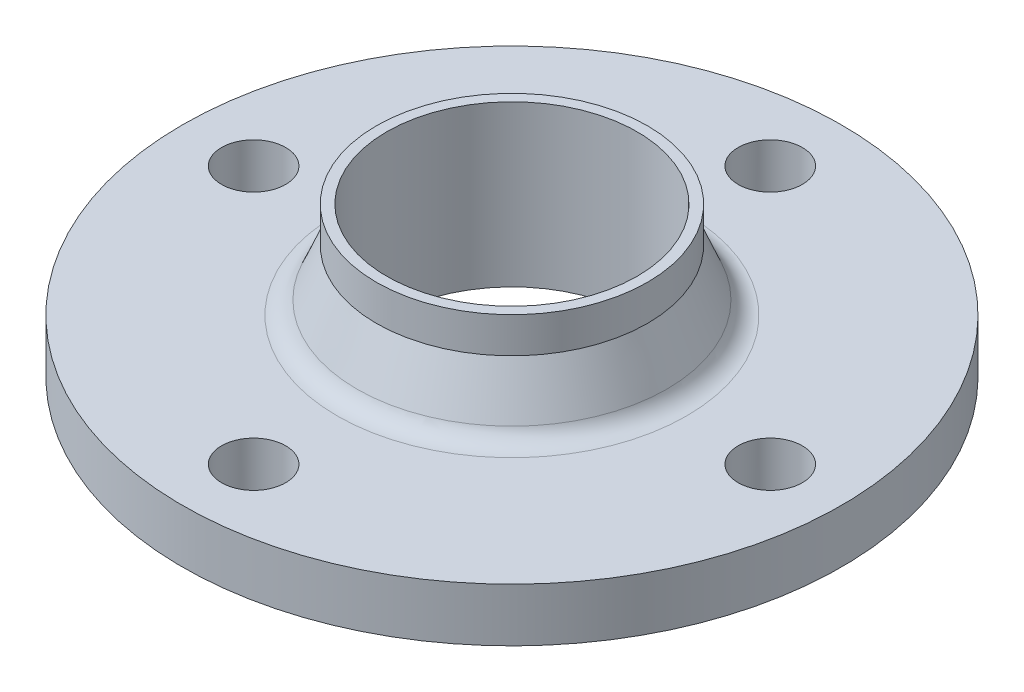
ISO-10303-21;
HEADER;
FILE_DESCRIPTION(('STEP AP214'),'2;1');
FILE_NAME('part.step','',(''),(''),'','','');
FILE_SCHEMA(('AUTOMOTIVE_DESIGN { 1 0 10303 214 1 1 1 1 }'));
ENDSEC;
DATA;
#1=APPLICATION_CONTEXT('core data for automotive mechanical design processes');
#2=APPLICATION_PROTOCOL_DEFINITION('international standard','automotive_design',2000,#1);
#3=PRODUCT_CONTEXT('',#1,'mechanical');
#4=PRODUCT('Part','Part','',(#3));
#5=PRODUCT_RELATED_PRODUCT_CATEGORY('part','',(#4));
#6=PRODUCT_DEFINITION_FORMATION('','',#4);
#7=PRODUCT_DEFINITION_CONTEXT('part definition',#1,'design');
#8=PRODUCT_DEFINITION('design','',#6,#7);
#9=PRODUCT_DEFINITION_SHAPE('','',#8);
#10=(LENGTH_UNIT() NAMED_UNIT(*) SI_UNIT(.MILLI.,.METRE.));
#11=(NAMED_UNIT(*) PLANE_ANGLE_UNIT() SI_UNIT($,.RADIAN.));
#12=(NAMED_UNIT(*) SI_UNIT($,.STERADIAN.) SOLID_ANGLE_UNIT());
#13=UNCERTAINTY_MEASURE_WITH_UNIT(LENGTH_MEASURE(1.E-05),#10,'distance_accuracy_value','');
#14=(GEOMETRIC_REPRESENTATION_CONTEXT(3) GLOBAL_UNCERTAINTY_ASSIGNED_CONTEXT((#13)) GLOBAL_UNIT_ASSIGNED_CONTEXT((#10,
#11,#12)) REPRESENTATION_CONTEXT('',''));
#15=CARTESIAN_POINT('',(0.,0.,0.));
#16=DIRECTION('',(0.,0.,1.));
#17=DIRECTION('',(1.,0.,0.));
#18=AXIS2_PLACEMENT_3D('',#15,#16,#17);
#19=CARTESIAN_POINT('',(0.,45.,0.));
#20=DIRECTION('',(0.,1.,0.));
#21=DIRECTION('',(-1.,0.,0.));
#22=AXIS2_PLACEMENT_3D('',#19,#20,#21);
#23=CYLINDRICAL_SURFACE('',#22,35.15);
#24=CARTESIAN_POINT('',(0.,0.,0.));
#25=DIRECTION('',(0.,1.,0.));
#26=DIRECTION('',(-1.,0.,0.));
#27=AXIS2_PLACEMENT_3D('',#24,#25,#26);
#28=CIRCLE('',#27,35.15);
#29=CARTESIAN_POINT('',(-35.15,0.,0.));
#30=VERTEX_POINT('',#29);
#31=EDGE_CURVE('E103',#30,#30,#28,.F.);
#32=ORIENTED_EDGE('',*,*,#31,.T.);
#33=EDGE_LOOP('',(#32));
#34=FACE_BOUND('',#33,.T.);
#35=CARTESIAN_POINT('',(0.,45.,0.));
#36=DIRECTION('',(0.,1.,0.));
#37=DIRECTION('',(-1.,0.,0.));
#38=AXIS2_PLACEMENT_3D('',#35,#36,#37);
#39=CIRCLE('',#38,35.15);
#40=CARTESIAN_POINT('',(-35.15,45.,0.));
#41=VERTEX_POINT('',#40);
#42=EDGE_CURVE('E18',#41,#41,#39,.T.);
#43=ORIENTED_EDGE('',*,*,#42,.T.);
#44=EDGE_LOOP('',(#43));
#45=FACE_BOUND('',#44,.T.);
#46=ADVANCED_FACE('F15',(#34,#45),#23,.F.);
#47=CARTESIAN_POINT('',(38.05,45.,0.));
#48=DIRECTION('',(0.,-1.,0.));
#49=DIRECTION('',(1.,0.,0.));
#50=AXIS2_PLACEMENT_3D('',#47,#48,#49);
#51=PLANE('',#50);
#52=CARTESIAN_POINT('',(0.,45.,0.));
#53=DIRECTION('',(0.,1.,0.));
#54=DIRECTION('',(-1.,0.,0.));
#55=AXIS2_PLACEMENT_3D('',#52,#53,#54);
#56=CIRCLE('',#55,38.05);
#57=CARTESIAN_POINT('',(-38.05,45.,0.));
#58=VERTEX_POINT('',#57);
#59=EDGE_CURVE('E101',#58,#58,#56,.F.);
#60=ORIENTED_EDGE('',*,*,#59,.F.);
#61=EDGE_LOOP('',(#60));
#62=FACE_BOUND('',#61,.T.);
#63=ORIENTED_EDGE('',*,*,#42,.F.);
#64=EDGE_LOOP('',(#63));
#65=FACE_BOUND('',#64,.T.);
#66=ADVANCED_FACE('F111',(#62,#65),#51,.F.);
#67=CARTESIAN_POINT('',(35.15,0.,0.));
#68=DIRECTION('',(0.,1.,0.));
#69=DIRECTION('',(0.,0.,1.));
#70=AXIS2_PLACEMENT_3D('',#67,#68,#69);
#71=PLANE('',#70);
#72=ORIENTED_EDGE('',*,*,#31,.F.);
#73=EDGE_LOOP('',(#72));
#74=FACE_BOUND('',#73,.T.);
#75=CARTESIAN_POINT('',(0.,0.,0.));
#76=DIRECTION('',(0.,1.,0.));
#77=DIRECTION('',(-1.,0.,0.));
#78=AXIS2_PLACEMENT_3D('',#75,#76,#77);
#79=CIRCLE('',#78,61.);
#80=CARTESIAN_POINT('',(-61.,0.,0.));
#81=VERTEX_POINT('',#80);
#82=EDGE_CURVE('E68',#81,#81,#79,.T.);
#83=ORIENTED_EDGE('',*,*,#82,.F.);
#84=EDGE_LOOP('',(#83));
#85=FACE_BOUND('',#84,.T.);
#86=ADVANCED_FACE('F113',(#74,#85),#71,.F.);
#87=CARTESIAN_POINT('',(0.,45.,0.));
#88=DIRECTION('',(0.,1.,0.));
#89=DIRECTION('',(-1.,0.,0.));
#90=AXIS2_PLACEMENT_3D('',#87,#88,#89);
#91=CYLINDRICAL_SURFACE('',#90,38.05);
#92=CARTESIAN_POINT('',(0.,35.,0.));
#93=DIRECTION('',(0.,-1.,0.));
#94=DIRECTION('',(1.,0.,0.));
#95=AXIS2_PLACEMENT_3D('',#92,#93,#94);
#96=CIRCLE('',#95,38.05);
#97=CARTESIAN_POINT('',(38.05,35.,0.));
#98=VERTEX_POINT('',#97);
#99=EDGE_CURVE('E96',#98,#98,#96,.T.);
#100=ORIENTED_EDGE('',*,*,#99,.F.);
#101=EDGE_LOOP('',(#100));
#102=FACE_BOUND('',#101,.T.);
#103=ORIENTED_EDGE('',*,*,#59,.T.);
#104=EDGE_LOOP('',(#103));
#105=FACE_BOUND('',#104,.T.);
#106=ADVANCED_FACE('F120',(#102,#105),#91,.T.);
#107=CARTESIAN_POINT('',(0.,3.00000000000002,0.));
#108=DIRECTION('',(0.,1.,0.));
#109=DIRECTION('',(-1.,0.,0.));
#110=AXIS2_PLACEMENT_3D('',#107,#108,#109);
#111=CONICAL_SURFACE('',#110,64.,0.785398163397449);
#112=CARTESIAN_POINT('',(0.,3.00000000000003,0.));
#113=DIRECTION('',(0.,1.,0.));
#114=DIRECTION('',(-1.,0.,0.));
#115=AXIS2_PLACEMENT_3D('',#112,#113,#114);
#116=CIRCLE('',#115,64.);
#117=CARTESIAN_POINT('',(-63.9396551724138,3.,-2.77857813149465));
#118=VERTEX_POINT('',#117);
#119=CARTESIAN_POINT('',(-63.9396551724138,3.00000000000002,2.77857813149382));
#120=VERTEX_POINT('',#119);
#121=EDGE_CURVE('E57',#118,#120,#116,.T.);
#122=ORIENTED_EDGE('',*,*,#121,.F.);
#123=CARTESIAN_POINT('',(0.,2.99999999999999,0.));
#124=DIRECTION('',(0.,1.,0.));
#125=DIRECTION('',(-1.,0.,0.));
#126=AXIS2_PLACEMENT_3D('',#123,#124,#125);
#127=CIRCLE('',#126,64.);
#128=CARTESIAN_POINT('',(-2.77857813149354,3.00000000000002,-63.9396551724138));
#129=VERTEX_POINT('',#128);
#130=EDGE_CURVE('E60',#118,#129,#127,.F.);
#131=ORIENTED_EDGE('',*,*,#130,.T.);
#132=CARTESIAN_POINT('',(0.,3.00000000000002,0.));
#133=DIRECTION('',(0.,1.,0.));
#134=DIRECTION('',(-1.,0.,0.));
#135=AXIS2_PLACEMENT_3D('',#132,#133,#134);
#136=CIRCLE('',#135,64.);
#137=CARTESIAN_POINT('',(2.77857813149502,3.,-63.9396551724138));
#138=VERTEX_POINT('',#137);
#139=EDGE_CURVE('E91',#138,#129,#136,.T.);
#140=ORIENTED_EDGE('',*,*,#139,.F.);
#141=CARTESIAN_POINT('',(0.,3.,0.));
#142=DIRECTION('',(0.,1.,0.));
#143=DIRECTION('',(-1.,0.,0.));
#144=AXIS2_PLACEMENT_3D('',#141,#142,#143);
#145=CIRCLE('',#144,64.);
#146=CARTESIAN_POINT('',(63.9396551724138,3.00000000000001,-2.77857813149431));
#147=VERTEX_POINT('',#146);
#148=EDGE_CURVE('E33',#138,#147,#145,.F.);
#149=ORIENTED_EDGE('',*,*,#148,.T.);
#150=CARTESIAN_POINT('',(0.,3.,0.));
#151=DIRECTION('',(0.,1.,0.));
#152=DIRECTION('',(-1.,0.,0.));
#153=AXIS2_PLACEMENT_3D('',#150,#151,#152);
#154=CIRCLE('',#153,64.);
#155=CARTESIAN_POINT('',(63.9396551724138,3.00000000000001,2.77857813149435));
#156=VERTEX_POINT('',#155);
#157=EDGE_CURVE('E67',#156,#147,#154,.T.);
#158=ORIENTED_EDGE('',*,*,#157,.F.);
#159=CARTESIAN_POINT('',(0.,3.00000000000001,0.));
#160=DIRECTION('',(0.,1.,0.));
#161=DIRECTION('',(-1.,0.,0.));
#162=AXIS2_PLACEMENT_3D('',#159,#160,#161);
#163=CIRCLE('',#162,64.);
#164=CARTESIAN_POINT('',(2.77857813149252,3.00000000000002,63.9396551724133));
#165=VERTEX_POINT('',#164);
#166=EDGE_CURVE('E87',#156,#165,#163,.F.);
#167=ORIENTED_EDGE('',*,*,#166,.T.);
#168=CARTESIAN_POINT('',(0.,2.99999999999942,0.));
#169=DIRECTION('',(0.,1.,0.));
#170=DIRECTION('',(-1.,0.,0.));
#171=AXIS2_PLACEMENT_3D('',#168,#169,#170);
#172=CIRCLE('',#171,63.9999999999994);
#173=CARTESIAN_POINT('',(-2.7785781314937,2.99999999999997,63.9396551724135));
#174=VERTEX_POINT('',#173);
#175=EDGE_CURVE('E93',#174,#165,#172,.T.);
#176=ORIENTED_EDGE('',*,*,#175,.F.);
#177=CARTESIAN_POINT('',(0.,2.99999999999999,0.));
#178=DIRECTION('',(0.,1.,0.));
#179=DIRECTION('',(-1.,0.,0.));
#180=AXIS2_PLACEMENT_3D('',#177,#178,#179);
#181=CIRCLE('',#180,64.);
#182=EDGE_CURVE('E63',#174,#120,#181,.F.);
#183=ORIENTED_EDGE('',*,*,#182,.T.);
#184=EDGE_LOOP('',(#122,#131,#140,#149,#158,#167,#176,#183));
#185=FACE_BOUND('',#184,.T.);
#186=ORIENTED_EDGE('',*,*,#82,.T.);
#187=EDGE_LOOP('',(#186));
#188=FACE_BOUND('',#187,.T.);
#189=ADVANCED_FACE('F58',(#185,#188),#111,.T.);
#190=CARTESIAN_POINT('',(-81.5,3.00000000000003,-5.69111787860829E-13));
#191=DIRECTION('',(0.,1.,0.));
#192=DIRECTION('',(0.,0.,1.));
#193=AXIS2_PLACEMENT_3D('',#190,#191,#192);
#194=PLANE('',#193);
#195=ORIENTED_EDGE('',*,*,#121,.T.);
#196=CARTESIAN_POINT('',(-72.5,3.00000000000003,-5.0626508736086E-13));
#197=DIRECTION('',(0.,1.,0.));
#198=DIRECTION('',(-1.,0.,0.));
#199=AXIS2_PLACEMENT_3D('',#196,#197,#198);
#200=CIRCLE('',#199,9.00000000000001);
#201=EDGE_CURVE('E75',#120,#118,#200,.T.);
#202=ORIENTED_EDGE('',*,*,#201,.T.);
#203=EDGE_LOOP('',(#195,#202));
#204=FACE_BOUND('',#203,.T.);
#205=ADVANCED_FACE('F82',(#204),#194,.T.);
#206=CARTESIAN_POINT('',(81.5,3.00000000000001,0.));
#207=DIRECTION('',(0.,1.,0.));
#208=DIRECTION('',(0.,0.,1.));
#209=AXIS2_PLACEMENT_3D('',#206,#207,#208);
#210=PLANE('',#209);
#211=ORIENTED_EDGE('',*,*,#157,.T.);
#212=CARTESIAN_POINT('',(72.5,3.00000000000001,0.));
#213=DIRECTION('',(0.,1.,0.));
#214=DIRECTION('',(0.,0.,1.));
#215=AXIS2_PLACEMENT_3D('',#212,#213,#214);
#216=CIRCLE('',#215,9.00000000000001);
#217=EDGE_CURVE('E80',#147,#156,#216,.T.);
#218=ORIENTED_EDGE('',*,*,#217,.T.);
#219=EDGE_LOOP('',(#211,#218));
#220=FACE_BOUND('',#219,.T.);
#221=ADVANCED_FACE('F204',(#220),#210,.T.);
#222=CARTESIAN_POINT('',(0.,21.7294750690261,0.));
#223=DIRECTION('',(0.,-1.,0.));
#224=DIRECTION('',(1.,0.,0.));
#225=AXIS2_PLACEMENT_3D('',#222,#223,#224);
#226=CONICAL_SURFACE('',#225,43.4753028394276,0.388089649341288);
#227=ORIENTED_EDGE('',*,*,#99,.T.);
#228=EDGE_LOOP('',(#227));
#229=FACE_BOUND('',#228,.T.);
#230=CARTESIAN_POINT('',(0.,21.7294750690261,0.));
#231=DIRECTION('',(0.,1.,0.));
#232=DIRECTION('',(-1.,0.,0.));
#233=AXIS2_PLACEMENT_3D('',#230,#231,#232);
#234=CIRCLE('',#233,43.4753028394276);
#235=CARTESIAN_POINT('',(-43.4753028394276,21.7294750690261,0.));
#236=VERTEX_POINT('',#235);
#237=EDGE_CURVE('E152',#236,#236,#234,.T.);
#238=ORIENTED_EDGE('',*,*,#237,.T.);
#239=EDGE_LOOP('',(#238));
#240=FACE_BOUND('',#239,.T.);
#241=ADVANCED_FACE('F216',(#229,#240),#226,.T.);
#242=CARTESIAN_POINT('',(-2.84258512763104E-13,3.00000000000002,81.5));
#243=DIRECTION('',(0.,1.,0.));
#244=DIRECTION('',(0.,0.,1.));
#245=AXIS2_PLACEMENT_3D('',#242,#243,#244);
#246=PLANE('',#245);
#247=ORIENTED_EDGE('',*,*,#175,.T.);
#248=CARTESIAN_POINT('',(-2.5283516251312E-13,3.00000000000002,72.5));
#249=DIRECTION('',(0.,1.,0.));
#250=DIRECTION('',(-1.,0.,0.));
#251=AXIS2_PLACEMENT_3D('',#248,#249,#250);
#252=CIRCLE('',#251,9.00000000000001);
#253=EDGE_CURVE('E194',#165,#174,#252,.T.);
#254=ORIENTED_EDGE('',*,*,#253,.T.);
#255=EDGE_LOOP('',(#247,#254));
#256=FACE_BOUND('',#255,.T.);
#257=ADVANCED_FACE('F213',(#256),#246,.T.);
#258=CARTESIAN_POINT('',(8.53965062958554E-13,3.00000000000002,-81.5));
#259=DIRECTION('',(0.,1.,0.));
#260=DIRECTION('',(0.,0.,1.));
#261=AXIS2_PLACEMENT_3D('',#258,#259,#260);
#262=PLANE('',#261);
#263=ORIENTED_EDGE('',*,*,#139,.T.);
#264=CARTESIAN_POINT('',(7.59695012208601E-13,3.00000000000002,-72.5));
#265=DIRECTION('',(0.,1.,0.));
#266=DIRECTION('',(0.,0.,1.));
#267=AXIS2_PLACEMENT_3D('',#264,#265,#266);
#268=CIRCLE('',#267,9.00000000000001);
#269=EDGE_CURVE('E189',#129,#138,#268,.T.);
#270=ORIENTED_EDGE('',*,*,#269,.T.);
#271=EDGE_LOOP('',(#263,#270));
#272=FACE_BOUND('',#271,.T.);
#273=ADVANCED_FACE('F215',(#272),#262,.T.);
#274=CARTESIAN_POINT('',(64.,3.,0.));
#275=DIRECTION('',(0.,1.,0.));
#276=DIRECTION('',(0.,0.,1.));
#277=AXIS2_PLACEMENT_3D('',#274,#275,#276);
#278=PLANE('',#277);
#279=CARTESIAN_POINT('',(7.59695012208601E-13,3.,-72.5));
#280=DIRECTION('',(0.,1.,0.));
#281=DIRECTION('',(0.,0.,1.));
#282=AXIS2_PLACEMENT_3D('',#279,#280,#281);
#283=CIRCLE('',#282,9.00000000000001);
#284=EDGE_CURVE('E73',#138,#129,#283,.T.);
#285=ORIENTED_EDGE('',*,*,#284,.T.);
#286=ORIENTED_EDGE('',*,*,#130,.F.);
#287=CARTESIAN_POINT('',(-72.5,3.,-5.0626508736086E-13));
#288=DIRECTION('',(0.,1.,0.));
#289=DIRECTION('',(-1.,0.,0.));
#290=AXIS2_PLACEMENT_3D('',#287,#288,#289);
#291=CIRCLE('',#290,9.00000000000001);
#292=EDGE_CURVE('E51',#118,#120,#291,.T.);
#293=ORIENTED_EDGE('',*,*,#292,.T.);
#294=ORIENTED_EDGE('',*,*,#182,.F.);
#295=CARTESIAN_POINT('',(-2.5283516251312E-13,3.,72.5));
#296=DIRECTION('',(0.,1.,0.));
#297=DIRECTION('',(-1.,0.,0.));
#298=AXIS2_PLACEMENT_3D('',#295,#296,#297);
#299=CIRCLE('',#298,9.00000000000001);
#300=EDGE_CURVE('E192',#174,#165,#299,.T.);
#301=ORIENTED_EDGE('',*,*,#300,.T.);
#302=ORIENTED_EDGE('',*,*,#166,.F.);
#303=CARTESIAN_POINT('',(72.5,3.00000000000001,0.));
#304=DIRECTION('',(0.,1.,0.));
#305=DIRECTION('',(0.,0.,1.));
#306=AXIS2_PLACEMENT_3D('',#303,#304,#305);
#307=CIRCLE('',#306,9.00000000000001);
#308=EDGE_CURVE('E200',#156,#147,#307,.T.);
#309=ORIENTED_EDGE('',*,*,#308,.T.);
#310=ORIENTED_EDGE('',*,*,#148,.F.);
#311=EDGE_LOOP('',(#285,#286,#293,#294,#301,#302,#309,#310));
#312=FACE_BOUND('',#311,.T.);
#313=CARTESIAN_POINT('',(0.,3.00000000000001,0.));
#314=DIRECTION('',(0.,1.,0.));
#315=DIRECTION('',(-1.,0.,0.));
#316=AXIS2_PLACEMENT_3D('',#313,#314,#315);
#317=CIRCLE('',#316,92.5);
#318=CARTESIAN_POINT('',(-92.5,3.00000000000001,0.));
#319=VERTEX_POINT('',#318);
#320=EDGE_CURVE('E197',#319,#319,#317,.T.);
#321=ORIENTED_EDGE('',*,*,#320,.F.);
#322=EDGE_LOOP('',(#321));
#323=FACE_BOUND('',#322,.T.);
#324=ADVANCED_FACE('F70',(#312,#323),#278,.F.);
#325=CARTESIAN_POINT('',(-72.5,18.,-5.0626508736086E-13));
#326=DIRECTION('',(0.,1.,0.));
#327=DIRECTION('',(-1.,0.,0.));
#328=AXIS2_PLACEMENT_3D('',#325,#326,#327);
#329=CYLINDRICAL_SURFACE('',#328,9.00000000000001);
#330=ORIENTED_EDGE('',*,*,#201,.F.);
#331=ORIENTED_EDGE('',*,*,#292,.F.);
#332=EDGE_LOOP('',(#330,#331));
#333=FACE_BOUND('',#332,.T.);
#334=CARTESIAN_POINT('',(-72.5,18.,-5.0626508736086E-13));
#335=DIRECTION('',(0.,1.,0.));
#336=DIRECTION('',(-1.,0.,0.));
#337=AXIS2_PLACEMENT_3D('',#334,#335,#336);
#338=CIRCLE('',#337,9.00000000000001);
#339=CARTESIAN_POINT('',(-81.5,18.,-5.0626508736086E-13));
#340=VERTEX_POINT('',#339);
#341=EDGE_CURVE('E185',#340,#340,#338,.T.);
#342=ORIENTED_EDGE('',*,*,#341,.T.);
#343=EDGE_LOOP('',(#342));
#344=FACE_BOUND('',#343,.T.);
#345=ADVANCED_FACE('F78',(#333,#344),#329,.F.);
#346=CARTESIAN_POINT('',(72.5,18.,0.));
#347=DIRECTION('',(0.,1.,0.));
#348=DIRECTION('',(0.,0.,1.));
#349=AXIS2_PLACEMENT_3D('',#346,#347,#348);
#350=CYLINDRICAL_SURFACE('',#349,9.00000000000001);
#351=CARTESIAN_POINT('',(72.5,18.,0.));
#352=DIRECTION('',(0.,1.,0.));
#353=DIRECTION('',(0.,0.,1.));
#354=AXIS2_PLACEMENT_3D('',#351,#352,#353);
#355=CIRCLE('',#354,9.00000000000001);
#356=CARTESIAN_POINT('',(72.5,18.,9.00000000000001));
#357=VERTEX_POINT('',#356);
#358=EDGE_CURVE('E182',#357,#357,#355,.T.);
#359=ORIENTED_EDGE('',*,*,#358,.T.);
#360=EDGE_LOOP('',(#359));
#361=FACE_BOUND('',#360,.T.);
#362=ORIENTED_EDGE('',*,*,#217,.F.);
#363=ORIENTED_EDGE('',*,*,#308,.F.);
#364=EDGE_LOOP('',(#362,#363));
#365=FACE_BOUND('',#364,.T.);
#366=ADVANCED_FACE('F161',(#361,#365),#350,.F.);
#367=CARTESIAN_POINT('',(0.,24.,0.));
#368=DIRECTION('',(0.,1.,0.));
#369=DIRECTION('',(-1.,0.,0.));
#370=AXIS2_PLACEMENT_3D('',#367,#368,#369);
#371=TOROIDAL_SURFACE('',#370,49.0291048288602,6.00000000000001);
#372=ORIENTED_EDGE('',*,*,#237,.F.);
#373=EDGE_LOOP('',(#372));
#374=FACE_BOUND('',#373,.T.);
#375=CARTESIAN_POINT('',(0.,18.,0.));
#376=DIRECTION('',(0.,1.,0.));
#377=DIRECTION('',(1.,0.,0.));
#378=AXIS2_PLACEMENT_3D('',#375,#376,#377);
#379=CIRCLE('',#378,49.0291048288602);
#380=CARTESIAN_POINT('',(49.0291048288602,18.,0.));
#381=VERTEX_POINT('',#380);
#382=EDGE_CURVE('E181',#381,#381,#379,.T.);
#383=ORIENTED_EDGE('',*,*,#382,.T.);
#384=EDGE_LOOP('',(#383));
#385=FACE_BOUND('',#384,.T.);
#386=ADVANCED_FACE('F155',(#374,#385),#371,.F.);
#387=CARTESIAN_POINT('',(0.,45.,0.));
#388=DIRECTION('',(0.,1.,0.));
#389=DIRECTION('',(-1.,0.,0.));
#390=AXIS2_PLACEMENT_3D('',#387,#388,#389);
#391=CYLINDRICAL_SURFACE('',#390,92.5);
#392=CARTESIAN_POINT('',(0.,18.,0.));
#393=DIRECTION('',(0.,1.,0.));
#394=DIRECTION('',(-1.,0.,0.));
#395=AXIS2_PLACEMENT_3D('',#392,#393,#394);
#396=CIRCLE('',#395,92.5);
#397=CARTESIAN_POINT('',(-92.5,18.,0.));
#398=VERTEX_POINT('',#397);
#399=EDGE_CURVE('E178',#398,#398,#396,.F.);
#400=ORIENTED_EDGE('',*,*,#399,.T.);
#401=EDGE_LOOP('',(#400));
#402=FACE_BOUND('',#401,.T.);
#403=ORIENTED_EDGE('',*,*,#320,.T.);
#404=EDGE_LOOP('',(#403));
#405=FACE_BOUND('',#404,.T.);
#406=ADVANCED_FACE('F160',(#402,#405),#391,.T.);
#407=CARTESIAN_POINT('',(-2.51348256676568E-13,18.,72.5));
#408=DIRECTION('',(0.,1.,0.));
#409=DIRECTION('',(-1.,0.,0.));
#410=AXIS2_PLACEMENT_3D('',#407,#408,#409);
#411=CYLINDRICAL_SURFACE('',#410,9.00000000000001);
#412=ORIENTED_EDGE('',*,*,#253,.F.);
#413=ORIENTED_EDGE('',*,*,#300,.F.);
#414=EDGE_LOOP('',(#412,#413));
#415=FACE_BOUND('',#414,.T.);
#416=CARTESIAN_POINT('',(-2.51348256676568E-13,18.,72.5));
#417=DIRECTION('',(0.,1.,0.));
#418=DIRECTION('',(-1.,0.,0.));
#419=AXIS2_PLACEMENT_3D('',#416,#417,#418);
#420=CIRCLE('',#419,9.00000000000001);
#421=CARTESIAN_POINT('',(-9.00000000000026,18.,72.5));
#422=VERTEX_POINT('',#421);
#423=EDGE_CURVE('E24',#422,#422,#420,.T.);
#424=ORIENTED_EDGE('',*,*,#423,.T.);
#425=EDGE_LOOP('',(#424));
#426=FACE_BOUND('',#425,.T.);
#427=ADVANCED_FACE('F132',(#415,#426),#411,.F.);
#428=CARTESIAN_POINT('',(7.61181918045152E-13,18.,-72.5));
#429=DIRECTION('',(0.,1.,0.));
#430=DIRECTION('',(0.,0.,1.));
#431=AXIS2_PLACEMENT_3D('',#428,#429,#430);
#432=CYLINDRICAL_SURFACE('',#431,9.00000000000001);
#433=ORIENTED_EDGE('',*,*,#269,.F.);
#434=ORIENTED_EDGE('',*,*,#284,.F.);
#435=EDGE_LOOP('',(#433,#434));
#436=FACE_BOUND('',#435,.T.);
#437=CARTESIAN_POINT('',(7.61181918045152E-13,18.,-72.5));
#438=DIRECTION('',(0.,1.,0.));
#439=DIRECTION('',(0.,0.,1.));
#440=AXIS2_PLACEMENT_3D('',#437,#438,#439);
#441=CIRCLE('',#440,9.00000000000001);
#442=CARTESIAN_POINT('',(7.61181918045152E-13,18.,-63.5));
#443=VERTEX_POINT('',#442);
#444=EDGE_CURVE('E9',#443,#443,#441,.T.);
#445=ORIENTED_EDGE('',*,*,#444,.T.);
#446=EDGE_LOOP('',(#445));
#447=FACE_BOUND('',#446,.T.);
#448=ADVANCED_FACE('F126',(#436,#447),#432,.F.);
#449=CARTESIAN_POINT('',(92.5,18.,0.));
#450=DIRECTION('',(0.,-1.,0.));
#451=DIRECTION('',(1.,0.,0.));
#452=AXIS2_PLACEMENT_3D('',#449,#450,#451);
#453=PLANE('',#452);
#454=ORIENTED_EDGE('',*,*,#444,.F.);
#455=EDGE_LOOP('',(#454));
#456=FACE_BOUND('',#455,.T.);
#457=ORIENTED_EDGE('',*,*,#423,.F.);
#458=EDGE_LOOP('',(#457));
#459=FACE_BOUND('',#458,.T.);
#460=ORIENTED_EDGE('',*,*,#399,.F.);
#461=EDGE_LOOP('',(#460));
#462=FACE_BOUND('',#461,.T.);
#463=ORIENTED_EDGE('',*,*,#382,.F.);
#464=EDGE_LOOP('',(#463));
#465=FACE_BOUND('',#464,.T.);
#466=ORIENTED_EDGE('',*,*,#358,.F.);
#467=EDGE_LOOP('',(#466));
#468=FACE_BOUND('',#467,.T.);
#469=ORIENTED_EDGE('',*,*,#341,.F.);
#470=EDGE_LOOP('',(#469));
#471=FACE_BOUND('',#470,.T.);
#472=ADVANCED_FACE('F124',(#456,#459,#462,#465,#468,#471),#453,.F.);
#473=CLOSED_SHELL('',(#46,#66,#86,#106,#189,#205,#221,#241,#257,#273,#324,#345,#366,#386,#406,
#427,#448,#472));
#474=MANIFOLD_SOLID_BREP('B1',#473);
#475=ADVANCED_BREP_SHAPE_REPRESENTATION('',(#18,#474),#14);
#476=SHAPE_DEFINITION_REPRESENTATION(#9,#475);
ENDSEC;
END-ISO-10303-21;
